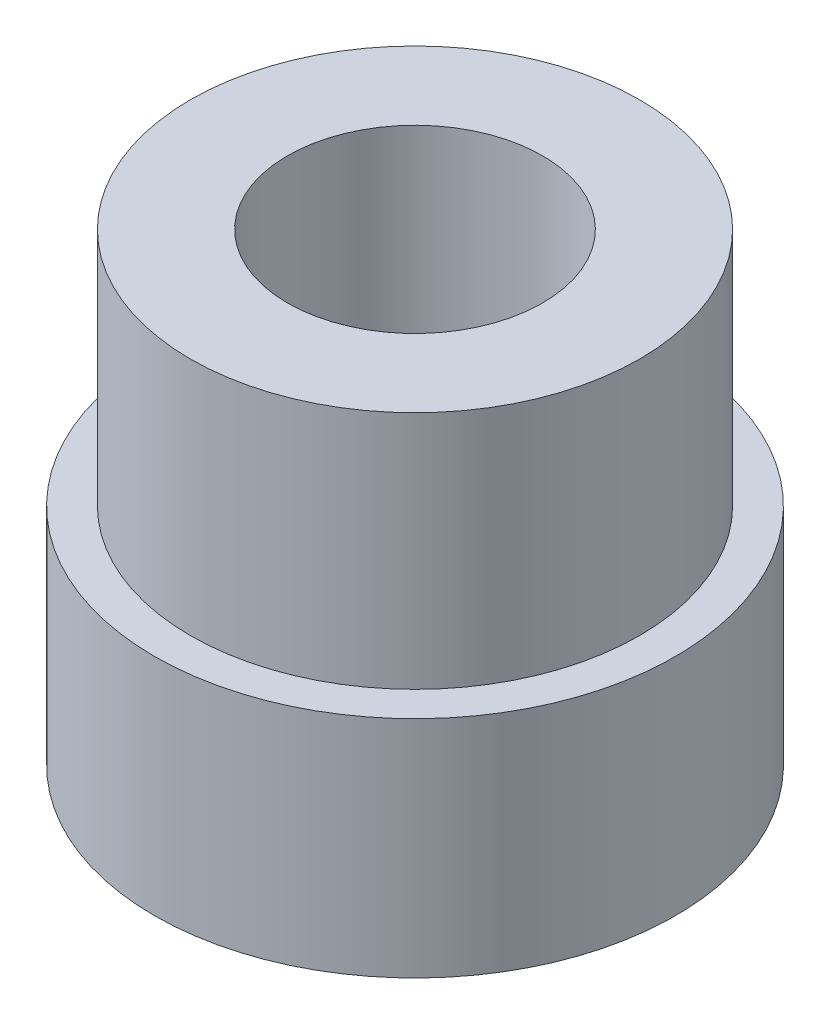
ISO-10303-21;
HEADER;
FILE_DESCRIPTION(('STEP AP214'),'2;1');
FILE_NAME('part.step','',(''),(''),'','','');
FILE_SCHEMA(('AUTOMOTIVE_DESIGN { 1 0 10303 214 1 1 1 1 }'));
ENDSEC;
DATA;
#1=APPLICATION_CONTEXT('core data for automotive mechanical design processes');
#2=APPLICATION_PROTOCOL_DEFINITION('international standard','automotive_design',2000,#1);
#3=PRODUCT_CONTEXT('',#1,'mechanical');
#4=PRODUCT('Part','Part','',(#3));
#5=PRODUCT_RELATED_PRODUCT_CATEGORY('part','',(#4));
#6=PRODUCT_DEFINITION_FORMATION('','',#4);
#7=PRODUCT_DEFINITION_CONTEXT('part definition',#1,'design');
#8=PRODUCT_DEFINITION('design','',#6,#7);
#9=PRODUCT_DEFINITION_SHAPE('','',#8);
#10=(LENGTH_UNIT() NAMED_UNIT(*) SI_UNIT(.MILLI.,.METRE.));
#11=(NAMED_UNIT(*) PLANE_ANGLE_UNIT() SI_UNIT($,.RADIAN.));
#12=(NAMED_UNIT(*) SI_UNIT($,.STERADIAN.) SOLID_ANGLE_UNIT());
#13=UNCERTAINTY_MEASURE_WITH_UNIT(LENGTH_MEASURE(1.E-05),#10,'distance_accuracy_value','');
#14=(GEOMETRIC_REPRESENTATION_CONTEXT(3) GLOBAL_UNCERTAINTY_ASSIGNED_CONTEXT((#13)) GLOBAL_UNIT_ASSIGNED_CONTEXT((#10,
#11,#12)) REPRESENTATION_CONTEXT('',''));
#15=CARTESIAN_POINT('',(0.,0.,0.));
#16=DIRECTION('',(0.,0.,1.));
#17=DIRECTION('',(1.,0.,0.));
#18=AXIS2_PLACEMENT_3D('',#15,#16,#17);
#19=CARTESIAN_POINT('',(0.,4.7625,0.));
#20=DIRECTION('',(0.,-1.,0.));
#21=DIRECTION('',(0.,0.,-1.));
#22=AXIS2_PLACEMENT_3D('',#19,#20,#21);
#23=CYLINDRICAL_SURFACE('',#22,5.5245);
#24=CARTESIAN_POINT('',(0.,4.7625,0.));
#25=DIRECTION('',(0.,1.,0.));
#26=DIRECTION('',(0.,0.,1.));
#27=AXIS2_PLACEMENT_3D('',#24,#25,#26);
#28=CIRCLE('',#27,5.5245);
#29=CARTESIAN_POINT('',(0.,4.7625,-5.5245));
#30=VERTEX_POINT('',#29);
#31=EDGE_CURVE('E46',#30,#30,#28,.T.);
#32=CARTESIAN_POINT('',(0.,0.,0.));
#33=DIRECTION('',(0.,1.,0.));
#34=DIRECTION('',(0.,0.,1.));
#35=AXIS2_PLACEMENT_3D('',#32,#33,#34);
#36=CIRCLE('',#35,5.5245);
#37=CARTESIAN_POINT('',(0.,0.,-5.5245));
#38=VERTEX_POINT('',#37);
#39=EDGE_CURVE('E42',#38,#38,#36,.T.);
#40=CARTESIAN_POINT('',(0.,4.7625,-5.5245));
#41=CARTESIAN_POINT('',(0.,4.712890625,-5.5245));
#42=CARTESIAN_POINT('',(0.,4.66328125,-5.5245));
#43=CARTESIAN_POINT('',(0.,4.5640625,-5.5245));
#44=CARTESIAN_POINT('',(0.,4.514453125,-5.5245));
#45=CARTESIAN_POINT('',(0.,4.415234375,-5.5245));
#46=CARTESIAN_POINT('',(0.,4.365625,-5.5245));
#47=CARTESIAN_POINT('',(0.,4.26640625,-5.5245));
#48=CARTESIAN_POINT('',(0.,4.216796875,-5.5245));
#49=CARTESIAN_POINT('',(0.,4.117578125,-5.5245));
#50=CARTESIAN_POINT('',(0.,4.06796875,-5.5245));
#51=CARTESIAN_POINT('',(0.,3.96875,-5.5245));
#52=CARTESIAN_POINT('',(0.,3.919140625,-5.5245));
#53=CARTESIAN_POINT('',(0.,3.819921875,-5.5245));
#54=CARTESIAN_POINT('',(0.,3.7703125,-5.5245));
#55=CARTESIAN_POINT('',(0.,3.67109375,-5.5245));
#56=CARTESIAN_POINT('',(0.,3.621484375,-5.5245));
#57=CARTESIAN_POINT('',(0.,3.522265625,-5.5245));
#58=CARTESIAN_POINT('',(0.,3.47265625,-5.5245));
#59=CARTESIAN_POINT('',(0.,3.3734375,-5.5245));
#60=CARTESIAN_POINT('',(0.,3.323828125,-5.5245));
#61=CARTESIAN_POINT('',(0.,3.224609375,-5.5245));
#62=CARTESIAN_POINT('',(0.,3.175,-5.5245));
#63=CARTESIAN_POINT('',(0.,3.07578125,-5.5245));
#64=CARTESIAN_POINT('',(0.,3.026171875,-5.5245));
#65=CARTESIAN_POINT('',(0.,2.926953125,-5.5245));
#66=CARTESIAN_POINT('',(0.,2.87734375,-5.5245));
#67=CARTESIAN_POINT('',(0.,2.778125,-5.5245));
#68=CARTESIAN_POINT('',(0.,2.728515625,-5.5245));
#69=CARTESIAN_POINT('',(0.,2.629296875,-5.5245));
#70=CARTESIAN_POINT('',(0.,2.5796875,-5.5245));
#71=CARTESIAN_POINT('',(0.,2.48046875,-5.5245));
#72=CARTESIAN_POINT('',(0.,2.430859375,-5.5245));
#73=CARTESIAN_POINT('',(0.,2.331640625,-5.5245));
#74=CARTESIAN_POINT('',(0.,2.28203125,-5.5245));
#75=CARTESIAN_POINT('',(0.,2.1828125,-5.5245));
#76=CARTESIAN_POINT('',(0.,2.133203125,-5.5245));
#77=CARTESIAN_POINT('',(0.,2.033984375,-5.5245));
#78=CARTESIAN_POINT('',(0.,1.984375,-5.5245));
#79=CARTESIAN_POINT('',(0.,1.88515625,-5.5245));
#80=CARTESIAN_POINT('',(0.,1.835546875,-5.5245));
#81=CARTESIAN_POINT('',(0.,1.736328125,-5.5245));
#82=CARTESIAN_POINT('',(0.,1.68671875,-5.5245));
#83=CARTESIAN_POINT('',(0.,1.5875,-5.5245));
#84=CARTESIAN_POINT('',(0.,1.537890625,-5.5245));
#85=CARTESIAN_POINT('',(0.,1.438671875,-5.5245));
#86=CARTESIAN_POINT('',(0.,1.3890625,-5.5245));
#87=CARTESIAN_POINT('',(0.,1.28984375,-5.5245));
#88=CARTESIAN_POINT('',(0.,1.240234375,-5.5245));
#89=CARTESIAN_POINT('',(0.,1.141015625,-5.5245));
#90=CARTESIAN_POINT('',(0.,1.09140625,-5.5245));
#91=CARTESIAN_POINT('',(0.,0.992187499999999,-5.5245));
#92=CARTESIAN_POINT('',(0.,0.942578124999999,-5.5245));
#93=CARTESIAN_POINT('',(0.,0.843359375,-5.5245));
#94=CARTESIAN_POINT('',(0.,0.79375,-5.5245));
#95=CARTESIAN_POINT('',(0.,0.69453125,-5.5245));
#96=CARTESIAN_POINT('',(0.,0.644921875,-5.5245));
#97=CARTESIAN_POINT('',(0.,0.545703125,-5.5245));
#98=CARTESIAN_POINT('',(0.,0.49609375,-5.5245));
#99=CARTESIAN_POINT('',(0.,0.396875,-5.5245));
#100=CARTESIAN_POINT('',(0.,0.347265625,-5.5245));
#101=CARTESIAN_POINT('',(0.,0.248046875,-5.5245));
#102=CARTESIAN_POINT('',(0.,0.1984375,-5.5245));
#103=CARTESIAN_POINT('',(0.,0.09921875,-5.5245));
#104=CARTESIAN_POINT('',(0.,0.049609375,-5.5245));
#105=CARTESIAN_POINT('',(0.,0.,-5.5245));
#106=B_SPLINE_CURVE_WITH_KNOTS('',3,(#40,#41,#42,#43,#44,#45,#46,#47,#48,#49,#50,#51,#52,#53,
#54,#55,#56,#57,#58,#59,#60,#61,#62,#63,#64,#65,#66,#67,#68,#69,#70,#71,#72,#73,#74,#75,#76,#77,
#78,#79,#80,#81,#82,#83,#84,#85,#86,#87,#88,#89,#90,#91,#92,#93,#94,#95,#96,#97,#98,#99,#100,
#101,#102,#103,#104,#105),.UNSPECIFIED.,.F.,.F.,(4,2,2,2,2,2,2,2,2,2,2,2,2,2,2,2,2,2,2,2,2,2,2,
2,2,2,2,2,2,2,2,2,4),(0.,0.148828125,0.29765625,0.446484375,0.5953125,0.744140625,
0.892968750000001,1.041796875,1.190625,1.339453125,1.48828125,1.637109375,1.7859375,1.934765625,
2.08359375,2.232421875,2.38125,2.530078125,2.67890625,2.827734375,2.9765625,3.125390625,
3.27421875,3.423046875,3.571875,3.720703125,3.86953125,4.018359375,4.1671875,4.316015625,
4.46484375,4.613671875,4.7625),.UNSPECIFIED.);
#107=EDGE_CURVE('BSEAM39',#30,#38,#106,.T.);
#108=ORIENTED_EDGE('',*,*,#31,.F.);
#109=ORIENTED_EDGE('',*,*,#39,.T.);
#110=ORIENTED_EDGE('',*,*,#107,.T.);
#111=ORIENTED_EDGE('',*,*,#107,.F.);
#112=EDGE_LOOP('',(#108,#110,#109,#111));
#113=FACE_BOUND('',#112,.T.);
#114=ADVANCED_FACE('F39',(#113),#23,.T.);
#115=CARTESIAN_POINT('',(0.,4.7625,0.));
#116=DIRECTION('',(0.,1.,0.));
#117=DIRECTION('',(0.,0.,1.));
#118=AXIS2_PLACEMENT_3D('',#115,#116,#117);
#119=PLANE('',#118);
#120=CARTESIAN_POINT('',(0.,4.7625,0.));
#121=DIRECTION('',(0.,1.,0.));
#122=DIRECTION('',(0.,0.,1.));
#123=AXIS2_PLACEMENT_3D('',#120,#121,#122);
#124=CIRCLE('',#123,4.7625);
#125=CARTESIAN_POINT('',(0.,4.7625,4.7625));
#126=VERTEX_POINT('',#125);
#127=EDGE_CURVE('E10',#126,#126,#124,.T.);
#128=ORIENTED_EDGE('',*,*,#127,.F.);
#129=EDGE_LOOP('',(#128));
#130=FACE_BOUND('',#129,.T.);
#131=ORIENTED_EDGE('',*,*,#31,.T.);
#132=EDGE_LOOP('',(#131));
#133=FACE_BOUND('',#132,.T.);
#134=ADVANCED_FACE('F84',(#130,#133),#119,.T.);
#135=CARTESIAN_POINT('',(0.,0.,0.));
#136=DIRECTION('',(0.,1.,0.));
#137=DIRECTION('',(0.,0.,1.));
#138=AXIS2_PLACEMENT_3D('',#135,#136,#137);
#139=PLANE('',#138);
#140=CARTESIAN_POINT('',(0.,0.,0.));
#141=DIRECTION('',(0.,1.,0.));
#142=DIRECTION('',(0.,0.,1.));
#143=AXIS2_PLACEMENT_3D('',#140,#141,#142);
#144=CIRCLE('',#143,2.7051);
#145=CARTESIAN_POINT('',(0.,0.,2.7051));
#146=VERTEX_POINT('',#145);
#147=EDGE_CURVE('E55',#146,#146,#144,.T.);
#148=ORIENTED_EDGE('',*,*,#147,.T.);
#149=EDGE_LOOP('',(#148));
#150=FACE_BOUND('',#149,.T.);
#151=ORIENTED_EDGE('',*,*,#39,.F.);
#152=EDGE_LOOP('',(#151));
#153=FACE_BOUND('',#152,.T.);
#154=ADVANCED_FACE('F62',(#150,#153),#139,.F.);
#155=CARTESIAN_POINT('',(0.,9.8425,0.));
#156=DIRECTION('',(0.,-1.,0.));
#157=DIRECTION('',(0.,0.,-1.));
#158=AXIS2_PLACEMENT_3D('',#155,#156,#157);
#159=CYLINDRICAL_SURFACE('',#158,4.7625);
#160=CARTESIAN_POINT('',(0.,9.8425,0.));
#161=DIRECTION('',(0.,1.,0.));
#162=DIRECTION('',(0.,0.,1.));
#163=AXIS2_PLACEMENT_3D('',#160,#161,#162);
#164=CIRCLE('',#163,4.7625);
#165=CARTESIAN_POINT('',(0.,9.8425,4.7625));
#166=VERTEX_POINT('',#165);
#167=EDGE_CURVE('E52',#166,#166,#164,.T.);
#168=ORIENTED_EDGE('',*,*,#167,.F.);
#169=EDGE_LOOP('',(#168));
#170=FACE_BOUND('',#169,.T.);
#171=ORIENTED_EDGE('',*,*,#127,.T.);
#172=EDGE_LOOP('',(#171));
#173=FACE_BOUND('',#172,.T.);
#174=ADVANCED_FACE('F74',(#170,#173),#159,.T.);
#175=CARTESIAN_POINT('',(0.,9.8425,0.));
#176=DIRECTION('',(0.,1.,0.));
#177=DIRECTION('',(0.,0.,1.));
#178=AXIS2_PLACEMENT_3D('',#175,#176,#177);
#179=PLANE('',#178);
#180=CARTESIAN_POINT('',(0.,9.8425,0.));
#181=DIRECTION('',(0.,1.,0.));
#182=DIRECTION('',(0.,0.,1.));
#183=AXIS2_PLACEMENT_3D('',#180,#181,#182);
#184=CIRCLE('',#183,2.7051);
#185=CARTESIAN_POINT('',(0.,9.8425,2.7051));
#186=VERTEX_POINT('',#185);
#187=EDGE_CURVE('E56',#186,#186,#184,.T.);
#188=ORIENTED_EDGE('',*,*,#187,.F.);
#189=EDGE_LOOP('',(#188));
#190=FACE_BOUND('',#189,.T.);
#191=ORIENTED_EDGE('',*,*,#167,.T.);
#192=EDGE_LOOP('',(#191));
#193=FACE_BOUND('',#192,.T.);
#194=ADVANCED_FACE('F68',(#190,#193),#179,.T.);
#195=CARTESIAN_POINT('',(0.,0.,0.));
#196=DIRECTION('',(0.,1.,0.));
#197=DIRECTION('',(0.,0.,1.));
#198=AXIS2_PLACEMENT_3D('',#195,#196,#197);
#199=CYLINDRICAL_SURFACE('',#198,2.7051);
#200=ORIENTED_EDGE('',*,*,#147,.F.);
#201=EDGE_LOOP('',(#200));
#202=FACE_BOUND('',#201,.T.);
#203=ORIENTED_EDGE('',*,*,#187,.T.);
#204=EDGE_LOOP('',(#203));
#205=FACE_BOUND('',#204,.T.);
#206=ADVANCED_FACE('F65',(#202,#205),#199,.F.);
#207=CLOSED_SHELL('',(#114,#134,#154,#174,#194,#206));
#208=MANIFOLD_SOLID_BREP('B2',#207);
#209=ADVANCED_BREP_SHAPE_REPRESENTATION('',(#18,#208),#14);
#210=SHAPE_DEFINITION_REPRESENTATION(#9,#209);
ENDSEC;
END-ISO-10303-21;
